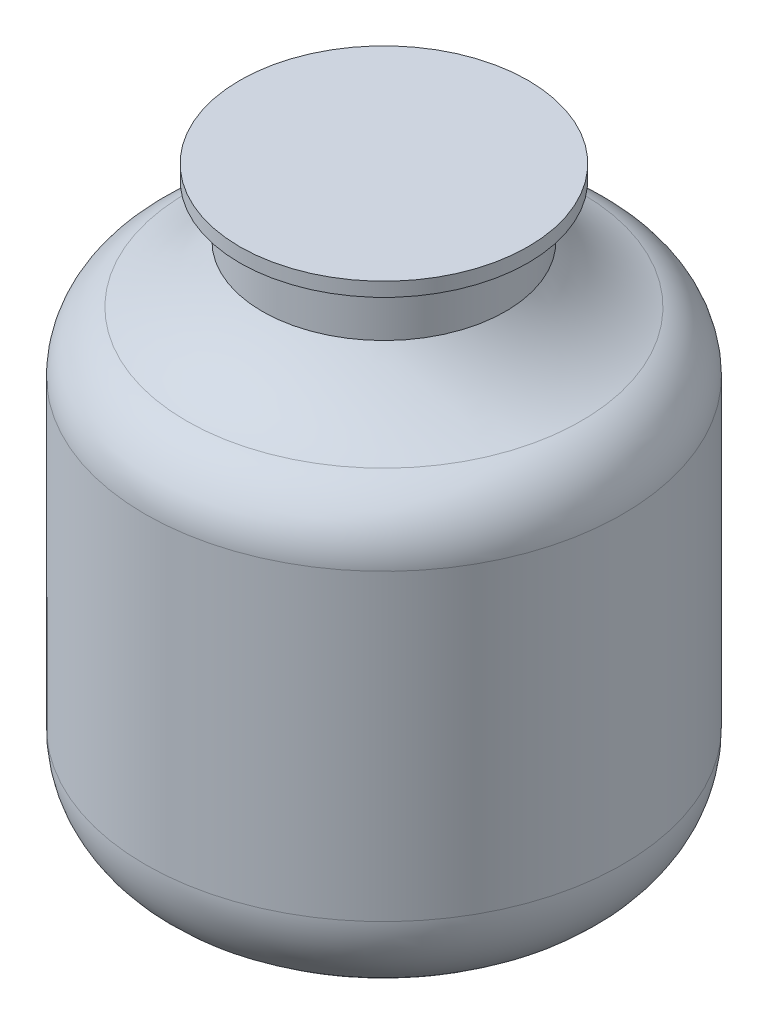
ISO-10303-21;
HEADER;
FILE_DESCRIPTION(('STEP AP214'),'2;1');
FILE_NAME('part.step','',(''),(''),'','','');
FILE_SCHEMA(('AUTOMOTIVE_DESIGN { 1 0 10303 214 1 1 1 1 }'));
ENDSEC;
DATA;
#1=APPLICATION_CONTEXT('core data for automotive mechanical design processes');
#2=APPLICATION_PROTOCOL_DEFINITION('international standard','automotive_design',2000,#1);
#3=PRODUCT_CONTEXT('',#1,'mechanical');
#4=PRODUCT('Part','Part','',(#3));
#5=PRODUCT_RELATED_PRODUCT_CATEGORY('part','',(#4));
#6=PRODUCT_DEFINITION_FORMATION('','',#4);
#7=PRODUCT_DEFINITION_CONTEXT('part definition',#1,'design');
#8=PRODUCT_DEFINITION('design','',#6,#7);
#9=PRODUCT_DEFINITION_SHAPE('','',#8);
#10=(LENGTH_UNIT() NAMED_UNIT(*) SI_UNIT(.MILLI.,.METRE.));
#11=(NAMED_UNIT(*) PLANE_ANGLE_UNIT() SI_UNIT($,.RADIAN.));
#12=(NAMED_UNIT(*) SI_UNIT($,.STERADIAN.) SOLID_ANGLE_UNIT());
#13=UNCERTAINTY_MEASURE_WITH_UNIT(LENGTH_MEASURE(1.E-05),#10,'distance_accuracy_value','');
#14=(GEOMETRIC_REPRESENTATION_CONTEXT(3) GLOBAL_UNCERTAINTY_ASSIGNED_CONTEXT((#13)) GLOBAL_UNIT_ASSIGNED_CONTEXT((#10,
#11,#12)) REPRESENTATION_CONTEXT('',''));
#15=CARTESIAN_POINT('',(0.,0.,0.));
#16=DIRECTION('',(0.,0.,1.));
#17=DIRECTION('',(1.,0.,0.));
#18=AXIS2_PLACEMENT_3D('',#15,#16,#17);
#19=CARTESIAN_POINT('',(0.,0.,0.));
#20=DIRECTION('',(0.,1.,0.));
#21=DIRECTION('',(0.,0.,1.));
#22=AXIS2_PLACEMENT_3D('',#19,#20,#21);
#23=PLANE('',#22);
#24=CARTESIAN_POINT('',(0.,0.,0.));
#25=DIRECTION('',(0.,1.,0.));
#26=DIRECTION('',(0.,0.,1.));
#27=AXIS2_PLACEMENT_3D('',#24,#25,#26);
#28=CIRCLE('',#27,24.3601458454961);
#29=CARTESIAN_POINT('',(0.,0.,24.3601458454961));
#30=VERTEX_POINT('',#29);
#31=EDGE_CURVE('E10',#30,#30,#28,.T.);
#32=ORIENTED_EDGE('',*,*,#31,.F.);
#33=EDGE_LOOP('',(#32));
#34=FACE_BOUND('',#33,.T.);
#35=ADVANCED_FACE('F33',(#34),#23,.F.);
#36=CARTESIAN_POINT('',(0.,15.9683633199807,0.));
#37=DIRECTION('',(0.,1.,0.));
#38=DIRECTION('',(0.,0.,1.));
#39=AXIS2_PLACEMENT_3D('',#36,#37,#38);
#40=TOROIDAL_SURFACE('',#39,24.3601458454961,15.9683633199807);
#41=CARTESIAN_POINT('',(0.,15.9683633199807,0.));
#42=DIRECTION('',(0.,1.,0.));
#43=DIRECTION('',(0.,0.,1.));
#44=AXIS2_PLACEMENT_3D('',#41,#42,#43);
#45=CIRCLE('',#44,40.3285091654769);
#46=CARTESIAN_POINT('',(0.,15.9683633199807,40.3285091654769));
#47=VERTEX_POINT('',#46);
#48=EDGE_CURVE('E39',#47,#47,#45,.T.);
#49=ORIENTED_EDGE('',*,*,#48,.F.);
#50=EDGE_LOOP('',(#49));
#51=FACE_BOUND('',#50,.T.);
#52=ORIENTED_EDGE('',*,*,#31,.T.);
#53=EDGE_LOOP('',(#52));
#54=FACE_BOUND('',#53,.T.);
#55=ADVANCED_FACE('F99',(#51,#54),#40,.T.);
#56=CARTESIAN_POINT('',(0.,98.3939694275288,0.));
#57=DIRECTION('',(0.,1.,0.));
#58=DIRECTION('',(0.,0.,1.));
#59=AXIS2_PLACEMENT_3D('',#56,#57,#58);
#60=CYLINDRICAL_SURFACE('',#59,40.3285091654769);
#61=CARTESIAN_POINT('',(0.,67.2301662901291,0.));
#62=DIRECTION('',(0.,1.,0.));
#63=DIRECTION('',(0.,0.,1.));
#64=AXIS2_PLACEMENT_3D('',#61,#62,#63);
#65=CIRCLE('',#64,40.3285091654769);
#66=CARTESIAN_POINT('',(0.,67.2301662901291,40.3285091654769));
#67=VERTEX_POINT('',#66);
#68=EDGE_CURVE('E43',#67,#67,#65,.T.);
#69=ORIENTED_EDGE('',*,*,#68,.F.);
#70=EDGE_LOOP('',(#69));
#71=FACE_BOUND('',#70,.T.);
#72=ORIENTED_EDGE('',*,*,#48,.T.);
#73=EDGE_LOOP('',(#72));
#74=FACE_BOUND('',#73,.T.);
#75=ADVANCED_FACE('F94',(#71,#74),#60,.T.);
#76=CARTESIAN_POINT('',(0.,67.2301662901291,0.));
#77=DIRECTION('',(0.,1.,0.));
#78=DIRECTION('',(0.,0.,1.));
#79=AXIS2_PLACEMENT_3D('',#76,#77,#78);
#80=TOROIDAL_SURFACE('',#79,29.4459217443869,10.88258742109);
#81=CARTESIAN_POINT('',(0.,77.3888781381647,0.));
#82=DIRECTION('',(0.,1.,0.));
#83=DIRECTION('',(0.,0.,1.));
#84=AXIS2_PLACEMENT_3D('',#81,#82,#83);
#85=CIRCLE('',#84,33.3486493247142);
#86=CARTESIAN_POINT('',(0.,77.3888781381647,33.3486493247142));
#87=VERTEX_POINT('',#86);
#88=EDGE_CURVE('E47',#87,#87,#85,.T.);
#89=ORIENTED_EDGE('',*,*,#88,.F.);
#90=EDGE_LOOP('',(#89));
#91=FACE_BOUND('',#90,.T.);
#92=ORIENTED_EDGE('',*,*,#68,.T.);
#93=EDGE_LOOP('',(#92));
#94=FACE_BOUND('',#93,.T.);
#95=ADVANCED_FACE('F88',(#91,#94),#80,.T.);
#96=CARTESIAN_POINT('',(0.,104.560398181296,0.));
#97=DIRECTION('',(0.,1.,0.));
#98=DIRECTION('',(0.,0.,1.));
#99=AXIS2_PLACEMENT_3D('',#96,#97,#98);
#100=TOROIDAL_SURFACE('',#99,43.7872799560426,29.1076709977213);
#101=CARTESIAN_POINT('',(0.,87.0227921881738,0.));
#102=DIRECTION('',(0.,1.,0.));
#103=DIRECTION('',(0.,0.,1.));
#104=AXIS2_PLACEMENT_3D('',#101,#102,#103);
#105=CIRCLE('',#104,20.5560749304398);
#106=CARTESIAN_POINT('',(0.,87.0227921881738,20.5560749304398));
#107=VERTEX_POINT('',#106);
#108=EDGE_CURVE('E52',#107,#107,#105,.T.);
#109=ORIENTED_EDGE('',*,*,#108,.F.);
#110=EDGE_LOOP('',(#109));
#111=FACE_BOUND('',#110,.T.);
#112=ORIENTED_EDGE('',*,*,#88,.T.);
#113=EDGE_LOOP('',(#112));
#114=FACE_BOUND('',#113,.T.);
#115=ADVANCED_FACE('F82',(#111,#114),#100,.F.);
#116=CARTESIAN_POINT('',(0.,98.3939694275288,0.));
#117=DIRECTION('',(0.,1.,0.));
#118=DIRECTION('',(0.,0.,1.));
#119=AXIS2_PLACEMENT_3D('',#116,#117,#118);
#120=CYLINDRICAL_SURFACE('',#119,20.5560749304398);
#121=CARTESIAN_POINT('',(0.,96.0249741693299,0.));
#122=DIRECTION('',(0.,1.,0.));
#123=DIRECTION('',(0.,0.,1.));
#124=AXIS2_PLACEMENT_3D('',#121,#122,#123);
#125=CIRCLE('',#124,20.5560749304398);
#126=CARTESIAN_POINT('',(0.,96.0249741693299,20.5560749304398));
#127=VERTEX_POINT('',#126);
#128=EDGE_CURVE('E55',#127,#127,#125,.T.);
#129=ORIENTED_EDGE('',*,*,#128,.F.);
#130=EDGE_LOOP('',(#129));
#131=FACE_BOUND('',#130,.T.);
#132=ORIENTED_EDGE('',*,*,#108,.T.);
#133=EDGE_LOOP('',(#132));
#134=FACE_BOUND('',#133,.T.);
#135=ADVANCED_FACE('F76',(#131,#134),#120,.T.);
#136=CARTESIAN_POINT('',(20.5560749304398,96.0249741693299,0.));
#137=DIRECTION('',(0.,1.,0.));
#138=DIRECTION('',(0.,0.,1.));
#139=AXIS2_PLACEMENT_3D('',#136,#137,#138);
#140=PLANE('',#139);
#141=CARTESIAN_POINT('',(0.,96.0249741693299,0.));
#142=DIRECTION('',(0.,1.,0.));
#143=DIRECTION('',(0.,0.,1.));
#144=AXIS2_PLACEMENT_3D('',#141,#142,#143);
#145=CIRCLE('',#144,24.3601458454961);
#146=CARTESIAN_POINT('',(0.,96.0249741693299,24.3601458454961));
#147=VERTEX_POINT('',#146);
#148=EDGE_CURVE('E58',#147,#147,#145,.T.);
#149=ORIENTED_EDGE('',*,*,#148,.F.);
#150=EDGE_LOOP('',(#149));
#151=FACE_BOUND('',#150,.T.);
#152=ORIENTED_EDGE('',*,*,#128,.T.);
#153=EDGE_LOOP('',(#152));
#154=FACE_BOUND('',#153,.T.);
#155=ADVANCED_FACE('F70',(#151,#154),#140,.F.);
#156=CARTESIAN_POINT('',(0.,98.3939694275288,0.));
#157=DIRECTION('',(0.,1.,0.));
#158=DIRECTION('',(0.,0.,1.));
#159=AXIS2_PLACEMENT_3D('',#156,#157,#158);
#160=CYLINDRICAL_SURFACE('',#159,24.3601458454961);
#161=CARTESIAN_POINT('',(0.,98.3939694275288,0.));
#162=DIRECTION('',(0.,1.,0.));
#163=DIRECTION('',(0.,0.,1.));
#164=AXIS2_PLACEMENT_3D('',#161,#162,#163);
#165=CIRCLE('',#164,24.3601458454961);
#166=CARTESIAN_POINT('',(0.,98.3939694275288,24.3601458454961));
#167=VERTEX_POINT('',#166);
#168=EDGE_CURVE('E61',#167,#167,#165,.T.);
#169=ORIENTED_EDGE('',*,*,#168,.F.);
#170=EDGE_LOOP('',(#169));
#171=FACE_BOUND('',#170,.T.);
#172=ORIENTED_EDGE('',*,*,#148,.T.);
#173=EDGE_LOOP('',(#172));
#174=FACE_BOUND('',#173,.T.);
#175=ADVANCED_FACE('F67',(#171,#174),#160,.T.);
#176=CARTESIAN_POINT('',(24.3601458454961,98.3939694275288,0.));
#177=DIRECTION('',(0.,-1.,0.));
#178=DIRECTION('',(0.,0.,-1.));
#179=AXIS2_PLACEMENT_3D('',#176,#177,#178);
#180=PLANE('',#179);
#181=ORIENTED_EDGE('',*,*,#168,.T.);
#182=EDGE_LOOP('',(#181));
#183=FACE_BOUND('',#182,.T.);
#184=ADVANCED_FACE('F65',(#183),#180,.F.);
#185=CLOSED_SHELL('',(#35,#55,#75,#95,#115,#135,#155,#175,#184));
#186=MANIFOLD_SOLID_BREP('B2',#185);
#187=ADVANCED_BREP_SHAPE_REPRESENTATION('',(#18,#186),#14);
#188=SHAPE_DEFINITION_REPRESENTATION(#9,#187);
ENDSEC;
END-ISO-10303-21;
